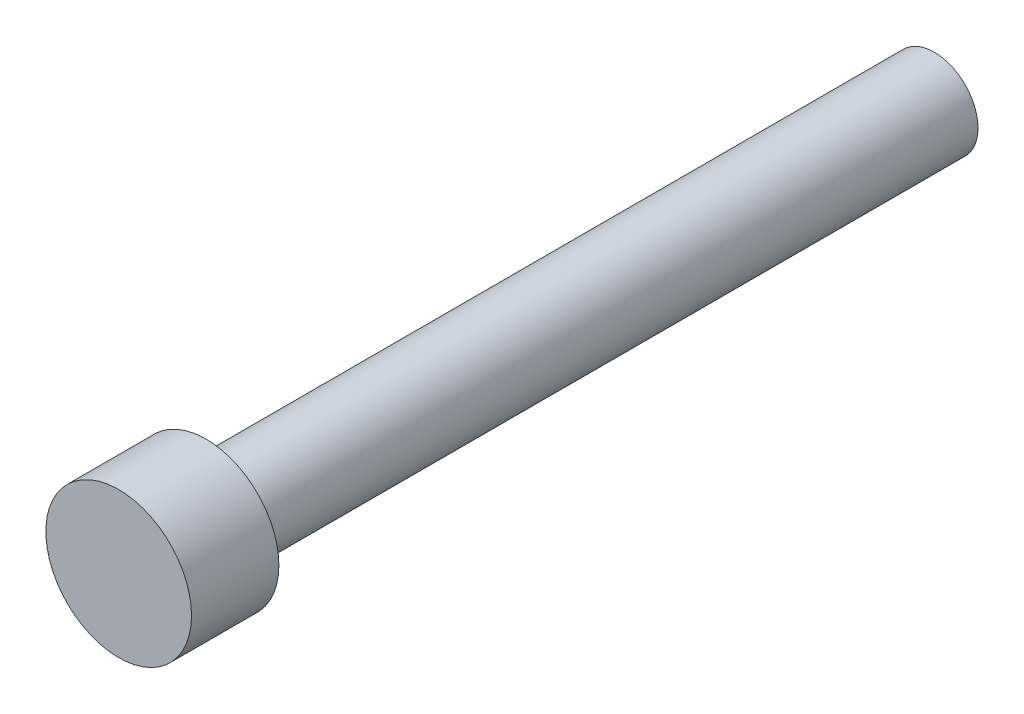
ISO-10303-21;
HEADER;
FILE_DESCRIPTION(('STEP AP214'),'2;1');
FILE_NAME('part.step','',(''),(''),'','','');
FILE_SCHEMA(('AUTOMOTIVE_DESIGN { 1 0 10303 214 1 1 1 1 }'));
ENDSEC;
DATA;
#1=APPLICATION_CONTEXT('core data for automotive mechanical design processes');
#2=APPLICATION_PROTOCOL_DEFINITION('international standard','automotive_design',2000,#1);
#3=PRODUCT_CONTEXT('',#1,'mechanical');
#4=PRODUCT('Part','Part','',(#3));
#5=PRODUCT_RELATED_PRODUCT_CATEGORY('part','',(#4));
#6=PRODUCT_DEFINITION_FORMATION('','',#4);
#7=PRODUCT_DEFINITION_CONTEXT('part definition',#1,'design');
#8=PRODUCT_DEFINITION('design','',#6,#7);
#9=PRODUCT_DEFINITION_SHAPE('','',#8);
#10=(LENGTH_UNIT() NAMED_UNIT(*) SI_UNIT(.MILLI.,.METRE.));
#11=(NAMED_UNIT(*) PLANE_ANGLE_UNIT() SI_UNIT($,.RADIAN.));
#12=(NAMED_UNIT(*) SI_UNIT($,.STERADIAN.) SOLID_ANGLE_UNIT());
#13=UNCERTAINTY_MEASURE_WITH_UNIT(LENGTH_MEASURE(1.E-05),#10,'distance_accuracy_value','');
#14=(GEOMETRIC_REPRESENTATION_CONTEXT(3) GLOBAL_UNCERTAINTY_ASSIGNED_CONTEXT((#13)) GLOBAL_UNIT_ASSIGNED_CONTEXT((#10,
#11,#12)) REPRESENTATION_CONTEXT('',''));
#15=CARTESIAN_POINT('',(0.,0.,0.));
#16=DIRECTION('',(0.,0.,1.));
#17=DIRECTION('',(1.,0.,0.));
#18=AXIS2_PLACEMENT_3D('',#15,#16,#17);
#19=CARTESIAN_POINT('',(0.,0.,50.));
#20=DIRECTION('',(0.,0.,-1.));
#21=DIRECTION('',(-1.,0.,0.));
#22=AXIS2_PLACEMENT_3D('',#19,#20,#21);
#23=CYLINDRICAL_SURFACE('',#22,3.);
#24=CARTESIAN_POINT('',(0.,0.,50.));
#25=DIRECTION('',(0.,0.,1.));
#26=DIRECTION('',(1.,0.,0.));
#27=AXIS2_PLACEMENT_3D('',#24,#25,#26);
#28=CIRCLE('',#27,3.);
#29=CARTESIAN_POINT('',(3.,0.,50.));
#30=VERTEX_POINT('',#29);
#31=EDGE_CURVE('E10',#30,#30,#28,.T.);
#32=ORIENTED_EDGE('',*,*,#31,.F.);
#33=EDGE_LOOP('',(#32));
#34=FACE_BOUND('',#33,.T.);
#35=CARTESIAN_POINT('',(0.,0.,0.));
#36=DIRECTION('',(0.,0.,1.));
#37=DIRECTION('',(1.,0.,0.));
#38=AXIS2_PLACEMENT_3D('',#35,#36,#37);
#39=CIRCLE('',#38,3.);
#40=CARTESIAN_POINT('',(3.,0.,0.));
#41=VERTEX_POINT('',#40);
#42=EDGE_CURVE('E40',#41,#41,#39,.T.);
#43=ORIENTED_EDGE('',*,*,#42,.T.);
#44=EDGE_LOOP('',(#43));
#45=FACE_BOUND('',#44,.T.);
#46=ADVANCED_FACE('F37',(#34,#45),#23,.T.);
#47=CARTESIAN_POINT('',(0.,0.,0.));
#48=DIRECTION('',(0.,0.,1.));
#49=DIRECTION('',(1.,0.,0.));
#50=AXIS2_PLACEMENT_3D('',#47,#48,#49);
#51=PLANE('',#50);
#52=ORIENTED_EDGE('',*,*,#42,.F.);
#53=EDGE_LOOP('',(#52));
#54=FACE_BOUND('',#53,.T.);
#55=ADVANCED_FACE('F60',(#54),#51,.F.);
#56=CARTESIAN_POINT('',(0.,0.,56.));
#57=DIRECTION('',(0.,0.,-1.));
#58=DIRECTION('',(-1.,0.,0.));
#59=AXIS2_PLACEMENT_3D('',#56,#57,#58);
#60=CYLINDRICAL_SURFACE('',#59,5.);
#61=CARTESIAN_POINT('',(0.,0.,56.));
#62=DIRECTION('',(0.,0.,1.));
#63=DIRECTION('',(1.,0.,0.));
#64=AXIS2_PLACEMENT_3D('',#61,#62,#63);
#65=CIRCLE('',#64,5.);
#66=CARTESIAN_POINT('',(5.,0.,56.));
#67=VERTEX_POINT('',#66);
#68=EDGE_CURVE('E47',#67,#67,#65,.T.);
#69=ORIENTED_EDGE('',*,*,#68,.F.);
#70=EDGE_LOOP('',(#69));
#71=FACE_BOUND('',#70,.T.);
#72=CARTESIAN_POINT('',(0.,0.,50.));
#73=DIRECTION('',(0.,0.,1.));
#74=DIRECTION('',(1.,0.,0.));
#75=AXIS2_PLACEMENT_3D('',#72,#73,#74);
#76=CIRCLE('',#75,5.);
#77=CARTESIAN_POINT('',(5.,0.,50.));
#78=VERTEX_POINT('',#77);
#79=EDGE_CURVE('E49',#78,#78,#76,.T.);
#80=ORIENTED_EDGE('',*,*,#79,.T.);
#81=EDGE_LOOP('',(#80));
#82=FACE_BOUND('',#81,.T.);
#83=ADVANCED_FACE('F57',(#71,#82),#60,.T.);
#84=CARTESIAN_POINT('',(0.,0.,56.));
#85=DIRECTION('',(0.,0.,1.));
#86=DIRECTION('',(1.,0.,0.));
#87=AXIS2_PLACEMENT_3D('',#84,#85,#86);
#88=PLANE('',#87);
#89=ORIENTED_EDGE('',*,*,#68,.T.);
#90=EDGE_LOOP('',(#89));
#91=FACE_BOUND('',#90,.T.);
#92=ADVANCED_FACE('F55',(#91),#88,.T.);
#93=CARTESIAN_POINT('',(0.,0.,50.));
#94=DIRECTION('',(0.,0.,1.));
#95=DIRECTION('',(1.,0.,0.));
#96=AXIS2_PLACEMENT_3D('',#93,#94,#95);
#97=PLANE('',#96);
#98=ORIENTED_EDGE('',*,*,#31,.T.);
#99=EDGE_LOOP('',(#98));
#100=FACE_BOUND('',#99,.T.);
#101=ORIENTED_EDGE('',*,*,#79,.F.);
#102=EDGE_LOOP('',(#101));
#103=FACE_BOUND('',#102,.T.);
#104=ADVANCED_FACE('F64',(#100,#103),#97,.F.);
#105=CLOSED_SHELL('',(#46,#55,#83,#92,#104));
#106=MANIFOLD_SOLID_BREP('B2',#105);
#107=ADVANCED_BREP_SHAPE_REPRESENTATION('',(#18,#106),#14);
#108=SHAPE_DEFINITION_REPRESENTATION(#9,#107);
ENDSEC;
END-ISO-10303-21;
